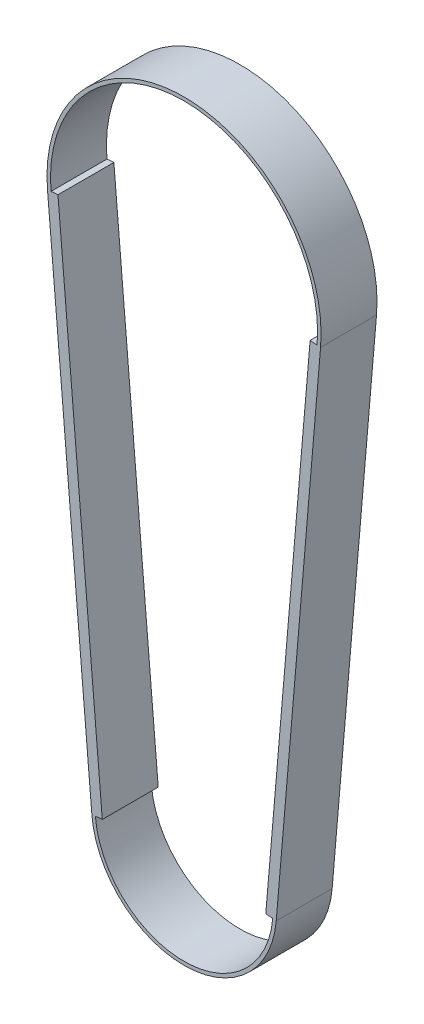
ISO-10303-21;
HEADER;
FILE_DESCRIPTION(('STEP AP214'),'2;1');
FILE_NAME('part.step','',(''),(''),'','','');
FILE_SCHEMA(('AUTOMOTIVE_DESIGN { 1 0 10303 214 1 1 1 1 }'));
ENDSEC;
DATA;
#1=APPLICATION_CONTEXT('core data for automotive mechanical design processes');
#2=APPLICATION_PROTOCOL_DEFINITION('international standard','automotive_design',2000,#1);
#3=PRODUCT_CONTEXT('',#1,'mechanical');
#4=PRODUCT('Part','Part','',(#3));
#5=PRODUCT_RELATED_PRODUCT_CATEGORY('part','',(#4));
#6=PRODUCT_DEFINITION_FORMATION('','',#4);
#7=PRODUCT_DEFINITION_CONTEXT('part definition',#1,'design');
#8=PRODUCT_DEFINITION('design','',#6,#7);
#9=PRODUCT_DEFINITION_SHAPE('','',#8);
#10=(LENGTH_UNIT() NAMED_UNIT(*) SI_UNIT(.MILLI.,.METRE.));
#11=(NAMED_UNIT(*) PLANE_ANGLE_UNIT() SI_UNIT($,.RADIAN.));
#12=(NAMED_UNIT(*) SI_UNIT($,.STERADIAN.) SOLID_ANGLE_UNIT());
#13=UNCERTAINTY_MEASURE_WITH_UNIT(LENGTH_MEASURE(1.E-05),#10,'distance_accuracy_value','');
#14=(GEOMETRIC_REPRESENTATION_CONTEXT(3) GLOBAL_UNCERTAINTY_ASSIGNED_CONTEXT((#13)) GLOBAL_UNIT_ASSIGNED_CONTEXT((#10,
#11,#12)) REPRESENTATION_CONTEXT('',''));
#15=CARTESIAN_POINT('',(0.,0.,0.));
#16=DIRECTION('',(0.,0.,1.));
#17=DIRECTION('',(1.,0.,0.));
#18=AXIS2_PLACEMENT_3D('',#15,#16,#17);
#19=CARTESIAN_POINT('',(0.,0.,32.));
#20=DIRECTION('',(0.,0.,1.));
#21=DIRECTION('',(1.,0.,0.));
#22=AXIS2_PLACEMENT_3D('',#19,#20,#21);
#23=PLANE('',#22);
#24=CARTESIAN_POINT('',(0.,0.,32.));
#25=DIRECTION('',(0.,0.,1.));
#26=DIRECTION('',(1.,0.,0.));
#27=AXIS2_PLACEMENT_3D('',#24,#25,#26);
#28=CIRCLE('',#27,78.3905);
#29=CARTESIAN_POINT('',(78.105635002026,-6.67684590059474,32.));
#30=VERTEX_POINT('',#29);
#31=CARTESIAN_POINT('',(-78.105635002026,-6.67684590059476,32.));
#32=VERTEX_POINT('',#31);
#33=EDGE_CURVE('E188',#30,#32,#28,.T.);
#34=ORIENTED_EDGE('',*,*,#33,.T.);
#35=DIRECTION('',(0.0851741716227698,-0.996366077547994,0.));
#36=VECTOR('',#35,1.);
#37=CARTESIAN_POINT('',(-78.105635002026,-6.67684590059476,32.));
#38=LINE('',#37,#36);
#39=CARTESIAN_POINT('',(-52.7346673863826,-303.466013381478,32.));
#40=VERTEX_POINT('',#39);
#41=EDGE_CURVE('E191',#32,#40,#38,.T.);
#42=ORIENTED_EDGE('',*,*,#41,.T.);
#43=CARTESIAN_POINT('',(0.,-298.958,32.));
#44=DIRECTION('',(0.,0.,1.));
#45=DIRECTION('',(1.,0.,0.));
#46=AXIS2_PLACEMENT_3D('',#43,#44,#45);
#47=CIRCLE('',#46,52.927);
#48=CARTESIAN_POINT('',(52.7346673863827,-303.466013381478,32.));
#49=VERTEX_POINT('',#48);
#50=EDGE_CURVE('E194',#40,#49,#47,.T.);
#51=ORIENTED_EDGE('',*,*,#50,.T.);
#52=DIRECTION('',(0.0851741716227696,0.996366077547994,0.));
#53=VECTOR('',#52,1.);
#54=CARTESIAN_POINT('',(52.7346673863827,-303.466013381478,32.));
#55=LINE('',#54,#53);
#56=EDGE_CURVE('E196',#49,#30,#55,.T.);
#57=ORIENTED_EDGE('',*,*,#56,.T.);
#58=EDGE_LOOP('',(#34,#42,#51,#57));
#59=FACE_BOUND('',#58,.T.);
#60=CARTESIAN_POINT('',(0.,-298.958,32.));
#61=DIRECTION('',(0.,0.,1.));
#62=DIRECTION('',(1.,0.,0.));
#63=AXIS2_PLACEMENT_3D('',#60,#61,#62);
#64=CIRCLE('',#63,50.927);
#65=CARTESIAN_POINT('',(-50.7419352312867,-303.295665038233,32.));
#66=VERTEX_POINT('',#65);
#67=CARTESIAN_POINT('',(50.7419352312868,-303.295665038233,32.));
#68=VERTEX_POINT('',#67);
#69=EDGE_CURVE('E49',#66,#68,#64,.T.);
#70=ORIENTED_EDGE('',*,*,#69,.F.);
#71=DIRECTION('',(-0.996366077547994,-0.0851741716227699,0.));
#72=VECTOR('',#71,1.);
#73=CARTESIAN_POINT('',(-46.7564709210947,-302.954968351742,32.));
#74=LINE('',#73,#72);
#75=CARTESIAN_POINT('',(-46.7564709210947,-302.954968351742,32.));
#76=VERTEX_POINT('',#75);
#77=EDGE_CURVE('E367',#76,#66,#74,.T.);
#78=ORIENTED_EDGE('',*,*,#77,.F.);
#79=DIRECTION('',(0.0851741716227699,-0.996366077547994,0.));
#80=VECTOR('',#79,1.);
#81=CARTESIAN_POINT('',(-72.1274385367381,-6.16580087085812,32.));
#82=LINE('',#81,#80);
#83=CARTESIAN_POINT('',(-72.1274385367381,-6.16580087085812,32.));
#84=VERTEX_POINT('',#83);
#85=EDGE_CURVE('E141',#84,#76,#82,.T.);
#86=ORIENTED_EDGE('',*,*,#85,.F.);
#87=DIRECTION('',(-0.996366077547994,-0.0851741716227699,0.));
#88=VECTOR('',#87,1.);
#89=CARTESIAN_POINT('',(-72.1274385367381,-6.16580087085812,32.));
#90=LINE('',#89,#88);
#91=CARTESIAN_POINT('',(-76.1129028469301,-6.5064975573492,32.));
#92=VERTEX_POINT('',#91);
#93=EDGE_CURVE('E153',#84,#92,#90,.T.);
#94=ORIENTED_EDGE('',*,*,#93,.T.);
#95=CARTESIAN_POINT('',(0.,0.,32.));
#96=DIRECTION('',(0.,0.,1.));
#97=DIRECTION('',(1.,0.,0.));
#98=AXIS2_PLACEMENT_3D('',#95,#96,#97);
#99=CIRCLE('',#98,76.3905);
#100=CARTESIAN_POINT('',(76.1129028469301,-6.50649755734919,32.));
#101=VERTEX_POINT('',#100);
#102=EDGE_CURVE('E173',#101,#92,#99,.T.);
#103=ORIENTED_EDGE('',*,*,#102,.F.);
#104=DIRECTION('',(0.996366077547994,-0.0851741716227696,0.));
#105=VECTOR('',#104,1.);
#106=CARTESIAN_POINT('',(72.1274385367381,-6.16580087085811,32.));
#107=LINE('',#106,#105);
#108=CARTESIAN_POINT('',(72.1274385367381,-6.16580087085811,32.));
#109=VERTEX_POINT('',#108);
#110=EDGE_CURVE('E162',#109,#101,#107,.T.);
#111=ORIENTED_EDGE('',*,*,#110,.F.);
#112=DIRECTION('',(0.0851741716227697,0.996366077547994,0.));
#113=VECTOR('',#112,1.);
#114=CARTESIAN_POINT('',(46.7564709210948,-302.954968351742,32.));
#115=LINE('',#114,#113);
#116=CARTESIAN_POINT('',(46.7564709210948,-302.954968351742,32.));
#117=VERTEX_POINT('',#116);
#118=EDGE_CURVE('E160',#117,#109,#115,.T.);
#119=ORIENTED_EDGE('',*,*,#118,.F.);
#120=DIRECTION('',(0.996366077547994,-0.0851741716227696,0.));
#121=VECTOR('',#120,1.);
#122=CARTESIAN_POINT('',(46.7564709210948,-302.954968351742,32.));
#123=LINE('',#122,#121);
#124=EDGE_CURVE('E165',#117,#68,#123,.T.);
#125=ORIENTED_EDGE('',*,*,#124,.T.);
#126=EDGE_LOOP('',(#70,#78,#86,#94,#103,#111,#119,#125));
#127=FACE_BOUND('',#126,.T.);
#128=ADVANCED_FACE('F34',(#59,#127),#23,.T.);
#129=CARTESIAN_POINT('',(0.,0.,0.));
#130=DIRECTION('',(0.,0.,1.));
#131=DIRECTION('',(1.,0.,0.));
#132=AXIS2_PLACEMENT_3D('',#129,#130,#131);
#133=PLANE('',#132);
#134=CARTESIAN_POINT('',(0.,0.,0.));
#135=DIRECTION('',(0.,0.,1.));
#136=DIRECTION('',(1.,0.,0.));
#137=AXIS2_PLACEMENT_3D('',#134,#135,#136);
#138=CIRCLE('',#137,78.3905);
#139=CARTESIAN_POINT('',(78.105635002026,-6.67684590059474,0.));
#140=VERTEX_POINT('',#139);
#141=CARTESIAN_POINT('',(-78.105635002026,-6.67684590059476,0.));
#142=VERTEX_POINT('',#141);
#143=EDGE_CURVE('E187',#140,#142,#138,.T.);
#144=ORIENTED_EDGE('',*,*,#143,.F.);
#145=DIRECTION('',(0.0851741716227696,0.996366077547994,0.));
#146=VECTOR('',#145,1.);
#147=CARTESIAN_POINT('',(52.7346673863827,-303.466013381478,0.));
#148=LINE('',#147,#146);
#149=CARTESIAN_POINT('',(52.7346673863827,-303.466013381478,0.));
#150=VERTEX_POINT('',#149);
#151=EDGE_CURVE('E192',#150,#140,#148,.T.);
#152=ORIENTED_EDGE('',*,*,#151,.F.);
#153=CARTESIAN_POINT('',(0.,-298.958,0.));
#154=DIRECTION('',(0.,0.,1.));
#155=DIRECTION('',(1.,0.,0.));
#156=AXIS2_PLACEMENT_3D('',#153,#154,#155);
#157=CIRCLE('',#156,52.927);
#158=CARTESIAN_POINT('',(-52.7346673863826,-303.466013381478,0.));
#159=VERTEX_POINT('',#158);
#160=EDGE_CURVE('E203',#159,#150,#157,.T.);
#161=ORIENTED_EDGE('',*,*,#160,.F.);
#162=DIRECTION('',(0.0851741716227698,-0.996366077547994,0.));
#163=VECTOR('',#162,1.);
#164=CARTESIAN_POINT('',(-78.105635002026,-6.67684590059476,0.));
#165=LINE('',#164,#163);
#166=EDGE_CURVE('E201',#142,#159,#165,.T.);
#167=ORIENTED_EDGE('',*,*,#166,.F.);
#168=EDGE_LOOP('',(#144,#152,#161,#167));
#169=FACE_BOUND('',#168,.T.);
#170=CARTESIAN_POINT('',(0.,0.,0.));
#171=DIRECTION('',(0.,0.,1.));
#172=DIRECTION('',(1.,0.,0.));
#173=AXIS2_PLACEMENT_3D('',#170,#171,#172);
#174=CIRCLE('',#173,76.3905);
#175=CARTESIAN_POINT('',(76.1129028469301,-6.50649755734919,0.));
#176=VERTEX_POINT('',#175);
#177=CARTESIAN_POINT('',(-76.1129028469301,-6.5064975573492,0.));
#178=VERTEX_POINT('',#177);
#179=EDGE_CURVE('E57',#176,#178,#174,.T.);
#180=ORIENTED_EDGE('',*,*,#179,.T.);
#181=DIRECTION('',(-0.996366077547994,-0.0851741716227699,0.));
#182=VECTOR('',#181,1.);
#183=CARTESIAN_POINT('',(-72.1274385367381,-6.16580087085812,0.));
#184=LINE('',#183,#182);
#185=CARTESIAN_POINT('',(-72.1274385367381,-6.16580087085812,0.));
#186=VERTEX_POINT('',#185);
#187=EDGE_CURVE('E132',#186,#178,#184,.T.);
#188=ORIENTED_EDGE('',*,*,#187,.F.);
#189=DIRECTION('',(-0.0851741716227699,0.996366077547994,0.));
#190=VECTOR('',#189,1.);
#191=CARTESIAN_POINT('',(-46.7564709210947,-302.954968351742,0.));
#192=LINE('',#191,#190);
#193=CARTESIAN_POINT('',(-46.7564709210947,-302.954968351742,0.));
#194=VERTEX_POINT('',#193);
#195=EDGE_CURVE('E124',#194,#186,#192,.T.);
#196=ORIENTED_EDGE('',*,*,#195,.F.);
#197=DIRECTION('',(-0.996366077547994,-0.0851741716227699,0.));
#198=VECTOR('',#197,1.);
#199=CARTESIAN_POINT('',(-46.7564709210947,-302.954968351742,0.));
#200=LINE('',#199,#198);
#201=CARTESIAN_POINT('',(-50.7419352312867,-303.295665038233,0.));
#202=VERTEX_POINT('',#201);
#203=EDGE_CURVE('E129',#194,#202,#200,.T.);
#204=ORIENTED_EDGE('',*,*,#203,.T.);
#205=CARTESIAN_POINT('',(0.,-298.958,0.));
#206=DIRECTION('',(0.,0.,1.));
#207=DIRECTION('',(1.,0.,0.));
#208=AXIS2_PLACEMENT_3D('',#205,#206,#207);
#209=CIRCLE('',#208,50.927);
#210=CARTESIAN_POINT('',(50.7419352312867,-303.295665038233,0.));
#211=VERTEX_POINT('',#210);
#212=EDGE_CURVE('E175',#202,#211,#209,.T.);
#213=ORIENTED_EDGE('',*,*,#212,.T.);
#214=DIRECTION('',(0.996366077547994,-0.0851741716227696,0.));
#215=VECTOR('',#214,1.);
#216=CARTESIAN_POINT('',(46.7564709210948,-302.954968351742,0.));
#217=LINE('',#216,#215);
#218=CARTESIAN_POINT('',(46.7564709210948,-302.954968351742,0.));
#219=VERTEX_POINT('',#218);
#220=EDGE_CURVE('E168',#219,#211,#217,.T.);
#221=ORIENTED_EDGE('',*,*,#220,.F.);
#222=DIRECTION('',(-0.0851741716227696,-0.996366077547994,0.));
#223=VECTOR('',#222,1.);
#224=CARTESIAN_POINT('',(72.1274385367381,-6.16580087085811,0.));
#225=LINE('',#224,#223);
#226=CARTESIAN_POINT('',(72.1274385367381,-6.16580087085811,0.));
#227=VERTEX_POINT('',#226);
#228=EDGE_CURVE('E151',#227,#219,#225,.T.);
#229=ORIENTED_EDGE('',*,*,#228,.F.);
#230=DIRECTION('',(0.996366077547994,-0.0851741716227696,0.));
#231=VECTOR('',#230,1.);
#232=CARTESIAN_POINT('',(72.1274385367381,-6.16580087085811,0.));
#233=LINE('',#232,#231);
#234=EDGE_CURVE('E171',#227,#176,#233,.T.);
#235=ORIENTED_EDGE('',*,*,#234,.T.);
#236=EDGE_LOOP('',(#180,#188,#196,#204,#213,#221,#229,#235));
#237=FACE_BOUND('',#236,.T.);
#238=ADVANCED_FACE('F126',(#169,#237),#133,.F.);
#239=CARTESIAN_POINT('',(0.,0.,32.));
#240=DIRECTION('',(0.,0.,-1.));
#241=DIRECTION('',(-1.,0.,0.));
#242=AXIS2_PLACEMENT_3D('',#239,#240,#241);
#243=CYLINDRICAL_SURFACE('',#242,78.3905);
#244=ORIENTED_EDGE('',*,*,#143,.T.);
#245=DIRECTION('',(0.,0.,-1.));
#246=VECTOR('',#245,1.);
#247=CARTESIAN_POINT('',(-78.105635002026,-6.67684590059476,32.));
#248=LINE('',#247,#246);
#249=EDGE_CURVE('E11',#32,#142,#248,.T.);
#250=ORIENTED_EDGE('',*,*,#249,.F.);
#251=ORIENTED_EDGE('',*,*,#33,.F.);
#252=DIRECTION('',(0.,0.,-1.));
#253=VECTOR('',#252,1.);
#254=CARTESIAN_POINT('',(78.105635002026,-6.67684590059474,32.));
#255=LINE('',#254,#253);
#256=EDGE_CURVE('E198',#30,#140,#255,.T.);
#257=ORIENTED_EDGE('',*,*,#256,.T.);
#258=EDGE_LOOP('',(#244,#250,#251,#257));
#259=FACE_BOUND('',#258,.T.);
#260=ADVANCED_FACE('F36',(#259),#243,.T.);
#261=CARTESIAN_POINT('',(-78.105635002026,-6.67684590059476,32.));
#262=DIRECTION('',(0.996366077547994,0.0851741716227699,0.));
#263=DIRECTION('',(-0.0851741716227699,0.996366077547994,0.));
#264=AXIS2_PLACEMENT_3D('',#261,#262,#263);
#265=PLANE('',#264);
#266=ORIENTED_EDGE('',*,*,#166,.T.);
#267=DIRECTION('',(0.,0.,-1.));
#268=VECTOR('',#267,1.);
#269=CARTESIAN_POINT('',(-52.7346673863826,-303.466013381478,32.));
#270=LINE('',#269,#268);
#271=EDGE_CURVE('E42',#40,#159,#270,.T.);
#272=ORIENTED_EDGE('',*,*,#271,.F.);
#273=ORIENTED_EDGE('',*,*,#41,.F.);
#274=ORIENTED_EDGE('',*,*,#249,.T.);
#275=EDGE_LOOP('',(#266,#272,#273,#274));
#276=FACE_BOUND('',#275,.T.);
#277=ADVANCED_FACE('F230',(#276),#265,.F.);
#278=CARTESIAN_POINT('',(0.,-298.958,32.));
#279=DIRECTION('',(0.,0.,-1.));
#280=DIRECTION('',(-1.,0.,0.));
#281=AXIS2_PLACEMENT_3D('',#278,#279,#280);
#282=CYLINDRICAL_SURFACE('',#281,52.927);
#283=ORIENTED_EDGE('',*,*,#160,.T.);
#284=DIRECTION('',(0.,0.,-1.));
#285=VECTOR('',#284,1.);
#286=CARTESIAN_POINT('',(52.7346673863827,-303.466013381478,32.));
#287=LINE('',#286,#285);
#288=EDGE_CURVE('E208',#49,#150,#287,.T.);
#289=ORIENTED_EDGE('',*,*,#288,.F.);
#290=ORIENTED_EDGE('',*,*,#50,.F.);
#291=ORIENTED_EDGE('',*,*,#271,.T.);
#292=EDGE_LOOP('',(#283,#289,#290,#291));
#293=FACE_BOUND('',#292,.T.);
#294=ADVANCED_FACE('F215',(#293),#282,.T.);
#295=CARTESIAN_POINT('',(52.7346673863827,-303.466013381478,32.));
#296=DIRECTION('',(-0.996366077547994,0.0851741716227696,0.));
#297=DIRECTION('',(-0.0851741716227696,-0.996366077547994,0.));
#298=AXIS2_PLACEMENT_3D('',#295,#296,#297);
#299=PLANE('',#298);
#300=ORIENTED_EDGE('',*,*,#151,.T.);
#301=ORIENTED_EDGE('',*,*,#256,.F.);
#302=ORIENTED_EDGE('',*,*,#56,.F.);
#303=ORIENTED_EDGE('',*,*,#288,.T.);
#304=EDGE_LOOP('',(#300,#301,#302,#303));
#305=FACE_BOUND('',#304,.T.);
#306=ADVANCED_FACE('F223',(#305),#299,.F.);
#307=CARTESIAN_POINT('',(0.,0.,32.));
#308=DIRECTION('',(0.,0.,-1.));
#309=DIRECTION('',(-1.,0.,0.));
#310=AXIS2_PLACEMENT_3D('',#307,#308,#309);
#311=CYLINDRICAL_SURFACE('',#310,76.3905);
#312=ORIENTED_EDGE('',*,*,#179,.F.);
#313=DIRECTION('',(0.,0.,-1.));
#314=VECTOR('',#313,1.);
#315=CARTESIAN_POINT('',(76.1129028469301,-6.50649755734919,32.));
#316=LINE('',#315,#314);
#317=EDGE_CURVE('E177',#101,#176,#316,.T.);
#318=ORIENTED_EDGE('',*,*,#317,.F.);
#319=ORIENTED_EDGE('',*,*,#102,.T.);
#320=DIRECTION('',(0.,0.,-1.));
#321=VECTOR('',#320,1.);
#322=CARTESIAN_POINT('',(-76.1129028469301,-6.5064975573492,32.));
#323=LINE('',#322,#321);
#324=EDGE_CURVE('E185',#92,#178,#323,.T.);
#325=ORIENTED_EDGE('',*,*,#324,.T.);
#326=EDGE_LOOP('',(#312,#318,#319,#325));
#327=FACE_BOUND('',#326,.T.);
#328=ADVANCED_FACE('F244',(#327),#311,.F.);
#329=CARTESIAN_POINT('',(0.,-298.958,32.));
#330=DIRECTION('',(0.,0.,-1.));
#331=DIRECTION('',(-1.,0.,0.));
#332=AXIS2_PLACEMENT_3D('',#329,#330,#331);
#333=CYLINDRICAL_SURFACE('',#332,50.927);
#334=ORIENTED_EDGE('',*,*,#212,.F.);
#335=DIRECTION('',(0.,0.,-1.));
#336=VECTOR('',#335,1.);
#337=CARTESIAN_POINT('',(-50.7419352312867,-303.295665038233,32.));
#338=LINE('',#337,#336);
#339=EDGE_CURVE('E147',#66,#202,#338,.T.);
#340=ORIENTED_EDGE('',*,*,#339,.F.);
#341=ORIENTED_EDGE('',*,*,#69,.T.);
#342=DIRECTION('',(0.,0.,-1.));
#343=VECTOR('',#342,1.);
#344=CARTESIAN_POINT('',(50.7419352312867,-303.295665038233,32.));
#345=LINE('',#344,#343);
#346=EDGE_CURVE('E182',#68,#211,#345,.T.);
#347=ORIENTED_EDGE('',*,*,#346,.T.);
#348=EDGE_LOOP('',(#334,#340,#341,#347));
#349=FACE_BOUND('',#348,.T.);
#350=ADVANCED_FACE('F251',(#349),#333,.F.);
#351=CARTESIAN_POINT('',(72.1274385367381,-6.16580087085811,32.));
#352=DIRECTION('',(-0.0851741716227696,-0.996366077547994,0.));
#353=DIRECTION('',(0.996366077547994,-0.0851741716227696,0.));
#354=AXIS2_PLACEMENT_3D('',#351,#352,#353);
#355=PLANE('',#354);
#356=ORIENTED_EDGE('',*,*,#317,.T.);
#357=ORIENTED_EDGE('',*,*,#234,.F.);
#358=DIRECTION('',(0.,0.,-1.));
#359=VECTOR('',#358,1.);
#360=CARTESIAN_POINT('',(72.1274385367381,-6.16580087085811,32.));
#361=LINE('',#360,#359);
#362=EDGE_CURVE('E148',#109,#227,#361,.T.);
#363=ORIENTED_EDGE('',*,*,#362,.F.);
#364=ORIENTED_EDGE('',*,*,#110,.T.);
#365=EDGE_LOOP('',(#356,#357,#363,#364));
#366=FACE_BOUND('',#365,.T.);
#367=ADVANCED_FACE('F255',(#366),#355,.F.);
#368=CARTESIAN_POINT('',(46.7564709210948,-302.954968351742,0.));
#369=DIRECTION('',(0.0851741716227696,0.996366077547994,0.));
#370=DIRECTION('',(-0.996366077547994,0.0851741716227696,0.));
#371=AXIS2_PLACEMENT_3D('',#368,#369,#370);
#372=PLANE('',#371);
#373=ORIENTED_EDGE('',*,*,#346,.F.);
#374=ORIENTED_EDGE('',*,*,#124,.F.);
#375=DIRECTION('',(0.,0.,1.));
#376=VECTOR('',#375,1.);
#377=CARTESIAN_POINT('',(46.7564709210948,-302.954968351742,0.));
#378=LINE('',#377,#376);
#379=EDGE_CURVE('E158',#219,#117,#378,.T.);
#380=ORIENTED_EDGE('',*,*,#379,.F.);
#381=ORIENTED_EDGE('',*,*,#220,.T.);
#382=EDGE_LOOP('',(#373,#374,#380,#381));
#383=FACE_BOUND('',#382,.T.);
#384=ADVANCED_FACE('F259',(#383),#372,.F.);
#385=CARTESIAN_POINT('',(72.1274385367381,-6.16580087085812,0.));
#386=DIRECTION('',(-0.996366077547994,0.0851741716227697,0.));
#387=DIRECTION('',(-0.0851741716227697,-0.996366077547994,0.));
#388=AXIS2_PLACEMENT_3D('',#385,#386,#387);
#389=PLANE('',#388);
#390=ORIENTED_EDGE('',*,*,#362,.T.);
#391=ORIENTED_EDGE('',*,*,#228,.T.);
#392=ORIENTED_EDGE('',*,*,#379,.T.);
#393=ORIENTED_EDGE('',*,*,#118,.T.);
#394=EDGE_LOOP('',(#390,#391,#392,#393));
#395=FACE_BOUND('',#394,.T.);
#396=ADVANCED_FACE('F265',(#395),#389,.T.);
#397=CARTESIAN_POINT('',(-46.7564709210947,-302.954968351742,32.));
#398=DIRECTION('',(-0.0851741716227699,0.996366077547994,0.));
#399=DIRECTION('',(-0.996366077547994,-0.0851741716227699,0.));
#400=AXIS2_PLACEMENT_3D('',#397,#398,#399);
#401=PLANE('',#400);
#402=ORIENTED_EDGE('',*,*,#339,.T.);
#403=ORIENTED_EDGE('',*,*,#203,.F.);
#404=DIRECTION('',(0.,0.,-1.));
#405=VECTOR('',#404,1.);
#406=CARTESIAN_POINT('',(-46.7564709210947,-302.954968351742,32.));
#407=LINE('',#406,#405);
#408=EDGE_CURVE('E136',#76,#194,#407,.T.);
#409=ORIENTED_EDGE('',*,*,#408,.F.);
#410=ORIENTED_EDGE('',*,*,#77,.T.);
#411=EDGE_LOOP('',(#402,#403,#409,#410));
#412=FACE_BOUND('',#411,.T.);
#413=ADVANCED_FACE('F146',(#412),#401,.F.);
#414=CARTESIAN_POINT('',(-72.1274385367381,-6.16580087085812,0.));
#415=DIRECTION('',(0.0851741716227699,-0.996366077547994,0.));
#416=DIRECTION('',(0.996366077547994,0.0851741716227699,0.));
#417=AXIS2_PLACEMENT_3D('',#414,#415,#416);
#418=PLANE('',#417);
#419=ORIENTED_EDGE('',*,*,#324,.F.);
#420=ORIENTED_EDGE('',*,*,#93,.F.);
#421=DIRECTION('',(0.,0.,1.));
#422=VECTOR('',#421,1.);
#423=CARTESIAN_POINT('',(-72.1274385367381,-6.16580087085812,0.));
#424=LINE('',#423,#422);
#425=EDGE_CURVE('E135',#186,#84,#424,.T.);
#426=ORIENTED_EDGE('',*,*,#425,.F.);
#427=ORIENTED_EDGE('',*,*,#187,.T.);
#428=EDGE_LOOP('',(#419,#420,#426,#427));
#429=FACE_BOUND('',#428,.T.);
#430=ADVANCED_FACE('F272',(#429),#418,.F.);
#431=CARTESIAN_POINT('',(-72.1274385367381,-6.16580087085812,0.));
#432=DIRECTION('',(0.996366077547994,0.0851741716227699,0.));
#433=DIRECTION('',(-0.0851741716227699,0.996366077547994,0.));
#434=AXIS2_PLACEMENT_3D('',#431,#432,#433);
#435=PLANE('',#434);
#436=ORIENTED_EDGE('',*,*,#408,.T.);
#437=ORIENTED_EDGE('',*,*,#195,.T.);
#438=ORIENTED_EDGE('',*,*,#425,.T.);
#439=ORIENTED_EDGE('',*,*,#85,.T.);
#440=EDGE_LOOP('',(#436,#437,#438,#439));
#441=FACE_BOUND('',#440,.T.);
#442=ADVANCED_FACE('F139',(#441),#435,.T.);
#443=CLOSED_SHELL('',(#128,#238,#260,#277,#294,#306,#328,#350,#367,#384,#396,#413,#430,#442));
#444=MANIFOLD_SOLID_BREP('B2',#443);
#445=ADVANCED_BREP_SHAPE_REPRESENTATION('',(#18,#444),#14);
#446=SHAPE_DEFINITION_REPRESENTATION(#9,#445);
ENDSEC;
END-ISO-10303-21;
